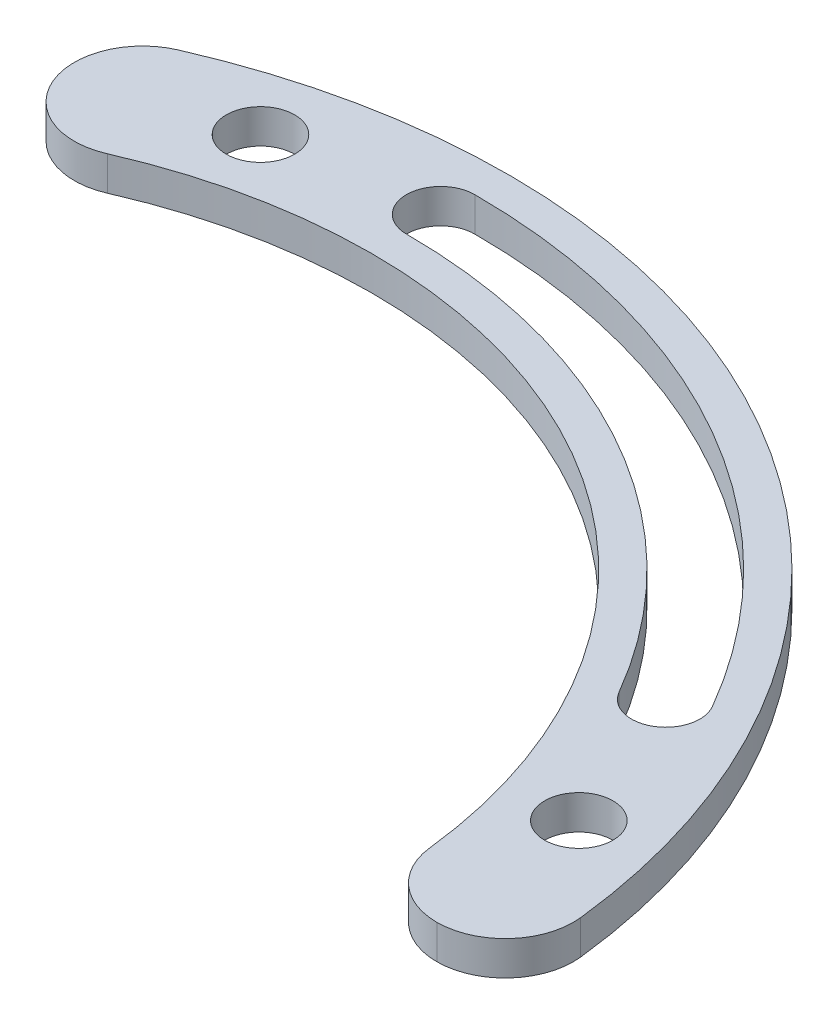
ISO-10303-21;
HEADER;
FILE_DESCRIPTION(('STEP AP214'),'2;1');
FILE_NAME('part.step','',(''),(''),'','','');
FILE_SCHEMA(('AUTOMOTIVE_DESIGN { 1 0 10303 214 1 1 1 1 }'));
ENDSEC;
DATA;
#1=APPLICATION_CONTEXT('core data for automotive mechanical design processes');
#2=APPLICATION_PROTOCOL_DEFINITION('international standard','automotive_design',2000,#1);
#3=PRODUCT_CONTEXT('',#1,'mechanical');
#4=PRODUCT('Part','Part','',(#3));
#5=PRODUCT_RELATED_PRODUCT_CATEGORY('part','',(#4));
#6=PRODUCT_DEFINITION_FORMATION('','',#4);
#7=PRODUCT_DEFINITION_CONTEXT('part definition',#1,'design');
#8=PRODUCT_DEFINITION('design','',#6,#7);
#9=PRODUCT_DEFINITION_SHAPE('','',#8);
#10=(LENGTH_UNIT() NAMED_UNIT(*) SI_UNIT(.MILLI.,.METRE.));
#11=(NAMED_UNIT(*) PLANE_ANGLE_UNIT() SI_UNIT($,.RADIAN.));
#12=(NAMED_UNIT(*) SI_UNIT($,.STERADIAN.) SOLID_ANGLE_UNIT());
#13=UNCERTAINTY_MEASURE_WITH_UNIT(LENGTH_MEASURE(1.E-05),#10,'distance_accuracy_value','');
#14=(GEOMETRIC_REPRESENTATION_CONTEXT(3) GLOBAL_UNCERTAINTY_ASSIGNED_CONTEXT((#13)) GLOBAL_UNIT_ASSIGNED_CONTEXT((#10,
#11,#12)) REPRESENTATION_CONTEXT('',''));
#15=CARTESIAN_POINT('',(0.,0.,0.));
#16=DIRECTION('',(0.,0.,1.));
#17=DIRECTION('',(1.,0.,0.));
#18=AXIS2_PLACEMENT_3D('',#15,#16,#17);
#19=CARTESIAN_POINT('',(0.,1.,0.));
#20=DIRECTION('',(0.,1.,0.));
#21=DIRECTION('',(0.,0.,1.));
#22=AXIS2_PLACEMENT_3D('',#19,#20,#21);
#23=PLANE('',#22);
#24=CARTESIAN_POINT('',(-4.65874281184533,1.,-17.3866648732032));
#25=DIRECTION('',(0.,1.,0.));
#26=DIRECTION('',(0.,0.,1.));
#27=AXIS2_PLACEMENT_3D('',#24,#25,#26);
#28=CIRCLE('',#27,1.);
#29=CARTESIAN_POINT('',(-4.65874281184533,1.,-16.3866648732032));
#30=VERTEX_POINT('',#29);
#31=EDGE_CURVE('E187',#30,#30,#28,.T.);
#32=ORIENTED_EDGE('',*,*,#31,.F.);
#33=EDGE_LOOP('',(#32));
#34=FACE_BOUND('',#33,.T.);
#35=CARTESIAN_POINT('',(-7.21222110243037,1.,-16.4919333848296));
#36=DIRECTION('',(0.,1.,0.));
#37=DIRECTION('',(0.,0.,1.));
#38=AXIS2_PLACEMENT_3D('',#35,#36,#37);
#39=CIRCLE('',#38,2.);
#40=CARTESIAN_POINT('',(-8.01357900270041,1.,-18.3243704275885));
#41=VERTEX_POINT('',#40);
#42=CARTESIAN_POINT('',(-8.94427190999924,1.,-15.4919333848296));
#43=VERTEX_POINT('',#42);
#44=EDGE_CURVE('E70',#41,#43,#39,.T.);
#45=ORIENTED_EDGE('',*,*,#44,.T.);
#46=CARTESIAN_POINT('',(-7.21222110243037,1.,-16.4919333848296));
#47=DIRECTION('',(0.,1.,0.));
#48=DIRECTION('',(0.,0.,1.));
#49=AXIS2_PLACEMENT_3D('',#46,#47,#48);
#50=CIRCLE('',#49,2.);
#51=CARTESIAN_POINT('',(-6.41086320216033,1.,-14.6594963420708));
#52=VERTEX_POINT('',#51);
#53=EDGE_CURVE('E235',#43,#52,#50,.T.);
#54=ORIENTED_EDGE('',*,*,#53,.T.);
#55=CARTESIAN_POINT('',(0.,1.,0.));
#56=DIRECTION('',(0.,-1.,0.));
#57=DIRECTION('',(0.,0.,1.));
#58=AXIS2_PLACEMENT_3D('',#55,#56,#57);
#59=CIRCLE('',#58,16.);
#60=CARTESIAN_POINT('',(15.9009278399985,1.,-1.77777777777779));
#61=VERTEX_POINT('',#60);
#62=EDGE_CURVE('E198',#52,#61,#59,.T.);
#63=ORIENTED_EDGE('',*,*,#62,.T.);
#64=CARTESIAN_POINT('',(17.8885438199983,1.,-2.00000000000001));
#65=DIRECTION('',(0.,1.,0.));
#66=DIRECTION('',(0.,0.,1.));
#67=AXIS2_PLACEMENT_3D('',#64,#65,#66);
#68=CIRCLE('',#67,2.);
#69=CARTESIAN_POINT('',(17.8885438199983,1.,0.));
#70=VERTEX_POINT('',#69);
#71=EDGE_CURVE('E63',#61,#70,#68,.T.);
#72=ORIENTED_EDGE('',*,*,#71,.T.);
#73=CARTESIAN_POINT('',(17.8885438199983,1.,-2.00000000000001));
#74=DIRECTION('',(0.,1.,0.));
#75=DIRECTION('',(0.,0.,1.));
#76=AXIS2_PLACEMENT_3D('',#73,#74,#75);
#77=CIRCLE('',#76,2.);
#78=CARTESIAN_POINT('',(19.8761597999981,1.,-2.22222222222223));
#79=VERTEX_POINT('',#78);
#80=EDGE_CURVE('E228',#70,#79,#77,.T.);
#81=ORIENTED_EDGE('',*,*,#80,.T.);
#82=CARTESIAN_POINT('',(0.,1.,0.));
#83=DIRECTION('',(0.,1.,0.));
#84=DIRECTION('',(0.,0.,1.));
#85=AXIS2_PLACEMENT_3D('',#82,#83,#84);
#86=CIRCLE('',#85,20.);
#87=EDGE_CURVE('E195',#79,#41,#86,.T.);
#88=ORIENTED_EDGE('',*,*,#87,.T.);
#89=EDGE_LOOP('',(#45,#54,#63,#72,#81,#88));
#90=FACE_BOUND('',#89,.T.);
#91=CARTESIAN_POINT('',(17.3866648732032,1.,-4.65874281184539));
#92=DIRECTION('',(0.,1.,0.));
#93=DIRECTION('',(0.,0.,1.));
#94=AXIS2_PLACEMENT_3D('',#91,#92,#93);
#95=CIRCLE('',#94,1.);
#96=CARTESIAN_POINT('',(17.3866648732032,1.,-3.65874281184539));
#97=VERTEX_POINT('',#96);
#98=EDGE_CURVE('E179',#97,#97,#95,.T.);
#99=ORIENTED_EDGE('',*,*,#98,.F.);
#100=EDGE_LOOP('',(#99));
#101=FACE_BOUND('',#100,.T.);
#102=CARTESIAN_POINT('',(0.,1.,0.));
#103=DIRECTION('',(0.,1.,0.));
#104=DIRECTION('',(0.,0.,1.));
#105=AXIS2_PLACEMENT_3D('',#102,#103,#104);
#106=CIRCLE('',#105,19.);
#107=CARTESIAN_POINT('',(16.4544826719043,1.,-9.50000000000003));
#108=VERTEX_POINT('',#107);
#109=CARTESIAN_POINT('',(0.,1.,-19.));
#110=VERTEX_POINT('',#109);
#111=EDGE_CURVE('E136',#108,#110,#106,.T.);
#112=ORIENTED_EDGE('',*,*,#111,.F.);
#113=CARTESIAN_POINT('',(15.5884572681199,1.,-9.00000000000002));
#114=DIRECTION('',(0.,1.,0.));
#115=DIRECTION('',(0.,0.,1.));
#116=AXIS2_PLACEMENT_3D('',#113,#114,#115);
#117=CIRCLE('',#116,0.999999999999999);
#118=CARTESIAN_POINT('',(14.7224318643354,1.,-8.50000000000002));
#119=VERTEX_POINT('',#118);
#120=EDGE_CURVE('E125',#119,#108,#117,.T.);
#121=ORIENTED_EDGE('',*,*,#120,.F.);
#122=CARTESIAN_POINT('',(0.,1.,0.));
#123=DIRECTION('',(0.,-1.,0.));
#124=DIRECTION('',(0.,0.,1.));
#125=AXIS2_PLACEMENT_3D('',#122,#123,#124);
#126=CIRCLE('',#125,17.);
#127=CARTESIAN_POINT('',(0.,1.,-17.));
#128=VERTEX_POINT('',#127);
#129=EDGE_CURVE('E154',#128,#119,#126,.T.);
#130=ORIENTED_EDGE('',*,*,#129,.F.);
#131=CARTESIAN_POINT('',(0.,1.,-18.));
#132=DIRECTION('',(0.,1.,0.));
#133=DIRECTION('',(0.,0.,1.));
#134=AXIS2_PLACEMENT_3D('',#131,#132,#133);
#135=CIRCLE('',#134,0.999999999999997);
#136=EDGE_CURVE('E150',#110,#128,#135,.T.);
#137=ORIENTED_EDGE('',*,*,#136,.F.);
#138=EDGE_LOOP('',(#112,#121,#130,#137));
#139=FACE_BOUND('',#138,.T.);
#140=ADVANCED_FACE('F45',(#34,#90,#101,#139),#23,.T.);
#141=CARTESIAN_POINT('',(0.,0.,0.));
#142=DIRECTION('',(0.,1.,0.));
#143=DIRECTION('',(0.,0.,1.));
#144=AXIS2_PLACEMENT_3D('',#141,#142,#143);
#145=PLANE('',#144);
#146=CARTESIAN_POINT('',(17.3866648732032,0.,-4.65874281184539));
#147=DIRECTION('',(0.,1.,0.));
#148=DIRECTION('',(0.,0.,1.));
#149=AXIS2_PLACEMENT_3D('',#146,#147,#148);
#150=CIRCLE('',#149,1.);
#151=CARTESIAN_POINT('',(17.3866648732032,0.,-3.65874281184539));
#152=VERTEX_POINT('',#151);
#153=EDGE_CURVE('E145',#152,#152,#150,.T.);
#154=ORIENTED_EDGE('',*,*,#153,.T.);
#155=EDGE_LOOP('',(#154));
#156=FACE_BOUND('',#155,.T.);
#157=CARTESIAN_POINT('',(-4.65874281184533,0.,-17.3866648732032));
#158=DIRECTION('',(0.,1.,0.));
#159=DIRECTION('',(0.,0.,1.));
#160=AXIS2_PLACEMENT_3D('',#157,#158,#159);
#161=CIRCLE('',#160,1.);
#162=CARTESIAN_POINT('',(-4.65874281184533,0.,-16.3866648732032));
#163=VERTEX_POINT('',#162);
#164=EDGE_CURVE('E183',#163,#163,#161,.T.);
#165=ORIENTED_EDGE('',*,*,#164,.T.);
#166=EDGE_LOOP('',(#165));
#167=FACE_BOUND('',#166,.T.);
#168=CARTESIAN_POINT('',(0.,0.,0.));
#169=DIRECTION('',(0.,-1.,0.));
#170=DIRECTION('',(0.,0.,1.));
#171=AXIS2_PLACEMENT_3D('',#168,#169,#170);
#172=CIRCLE('',#171,16.);
#173=CARTESIAN_POINT('',(-6.41086320216033,0.,-14.6594963420708));
#174=VERTEX_POINT('',#173);
#175=CARTESIAN_POINT('',(15.9009278399985,0.,-1.77777777777779));
#176=VERTEX_POINT('',#175);
#177=EDGE_CURVE('E199',#174,#176,#172,.T.);
#178=ORIENTED_EDGE('',*,*,#177,.F.);
#179=CARTESIAN_POINT('',(-7.21222110243037,0.,-16.4919333848296));
#180=DIRECTION('',(0.,1.,0.));
#181=DIRECTION('',(0.,0.,1.));
#182=AXIS2_PLACEMENT_3D('',#179,#180,#181);
#183=CIRCLE('',#182,2.);
#184=CARTESIAN_POINT('',(-8.94427190999924,0.,-15.4919333848296));
#185=VERTEX_POINT('',#184);
#186=EDGE_CURVE('E225',#174,#185,#183,.F.);
#187=ORIENTED_EDGE('',*,*,#186,.T.);
#188=CARTESIAN_POINT('',(-7.21222110243037,0.,-16.4919333848296));
#189=DIRECTION('',(0.,1.,0.));
#190=DIRECTION('',(0.,0.,1.));
#191=AXIS2_PLACEMENT_3D('',#188,#189,#190);
#192=CIRCLE('',#191,2.);
#193=CARTESIAN_POINT('',(-8.01357900270041,0.,-18.3243704275885));
#194=VERTEX_POINT('',#193);
#195=EDGE_CURVE('E222',#185,#194,#192,.F.);
#196=ORIENTED_EDGE('',*,*,#195,.T.);
#197=CARTESIAN_POINT('',(0.,0.,0.));
#198=DIRECTION('',(0.,1.,0.));
#199=DIRECTION('',(0.,0.,1.));
#200=AXIS2_PLACEMENT_3D('',#197,#198,#199);
#201=CIRCLE('',#200,20.);
#202=CARTESIAN_POINT('',(19.8761597999981,0.,-2.22222222222223));
#203=VERTEX_POINT('',#202);
#204=EDGE_CURVE('E191',#203,#194,#201,.T.);
#205=ORIENTED_EDGE('',*,*,#204,.F.);
#206=CARTESIAN_POINT('',(17.8885438199983,0.,-2.00000000000001));
#207=DIRECTION('',(0.,1.,0.));
#208=DIRECTION('',(0.,0.,1.));
#209=AXIS2_PLACEMENT_3D('',#206,#207,#208);
#210=CIRCLE('',#209,2.);
#211=CARTESIAN_POINT('',(17.8885438199983,0.,0.));
#212=VERTEX_POINT('',#211);
#213=EDGE_CURVE('E216',#203,#212,#210,.F.);
#214=ORIENTED_EDGE('',*,*,#213,.T.);
#215=CARTESIAN_POINT('',(17.8885438199983,0.,-2.00000000000001));
#216=DIRECTION('',(0.,1.,0.));
#217=DIRECTION('',(0.,0.,1.));
#218=AXIS2_PLACEMENT_3D('',#215,#216,#217);
#219=CIRCLE('',#218,2.);
#220=EDGE_CURVE('E219',#212,#176,#219,.F.);
#221=ORIENTED_EDGE('',*,*,#220,.T.);
#222=EDGE_LOOP('',(#178,#187,#196,#205,#214,#221));
#223=FACE_BOUND('',#222,.T.);
#224=CARTESIAN_POINT('',(15.5884572681199,0.,-9.00000000000002));
#225=DIRECTION('',(0.,1.,0.));
#226=DIRECTION('',(0.,0.,1.));
#227=AXIS2_PLACEMENT_3D('',#224,#225,#226);
#228=CIRCLE('',#227,0.999999999999999);
#229=CARTESIAN_POINT('',(14.7224318643354,0.,-8.50000000000002));
#230=VERTEX_POINT('',#229);
#231=CARTESIAN_POINT('',(16.4544826719043,0.,-9.50000000000003));
#232=VERTEX_POINT('',#231);
#233=EDGE_CURVE('E159',#230,#232,#228,.T.);
#234=ORIENTED_EDGE('',*,*,#233,.T.);
#235=CARTESIAN_POINT('',(0.,0.,0.));
#236=DIRECTION('',(0.,1.,0.));
#237=DIRECTION('',(0.,0.,1.));
#238=AXIS2_PLACEMENT_3D('',#235,#236,#237);
#239=CIRCLE('',#238,19.);
#240=CARTESIAN_POINT('',(0.,0.,-19.));
#241=VERTEX_POINT('',#240);
#242=EDGE_CURVE('E143',#232,#241,#239,.T.);
#243=ORIENTED_EDGE('',*,*,#242,.T.);
#244=CARTESIAN_POINT('',(0.,0.,-18.));
#245=DIRECTION('',(0.,1.,0.));
#246=DIRECTION('',(0.,0.,1.));
#247=AXIS2_PLACEMENT_3D('',#244,#245,#246);
#248=CIRCLE('',#247,0.999999999999997);
#249=CARTESIAN_POINT('',(0.,0.,-17.));
#250=VERTEX_POINT('',#249);
#251=EDGE_CURVE('E165',#241,#250,#248,.T.);
#252=ORIENTED_EDGE('',*,*,#251,.T.);
#253=CARTESIAN_POINT('',(0.,0.,0.));
#254=DIRECTION('',(0.,-1.,0.));
#255=DIRECTION('',(0.,0.,1.));
#256=AXIS2_PLACEMENT_3D('',#253,#254,#255);
#257=CIRCLE('',#256,17.);
#258=EDGE_CURVE('E137',#250,#230,#257,.T.);
#259=ORIENTED_EDGE('',*,*,#258,.T.);
#260=EDGE_LOOP('',(#234,#243,#252,#259));
#261=FACE_BOUND('',#260,.T.);
#262=ADVANCED_FACE('F269',(#156,#167,#223,#261),#145,.F.);
#263=CARTESIAN_POINT('',(0.,1.,0.));
#264=DIRECTION('',(0.,-1.,0.));
#265=DIRECTION('',(0.,0.,-1.));
#266=AXIS2_PLACEMENT_3D('',#263,#264,#265);
#267=CYLINDRICAL_SURFACE('',#266,20.);
#268=ORIENTED_EDGE('',*,*,#204,.T.);
#269=DIRECTION('',(0.,-1.,0.));
#270=VECTOR('',#269,1.);
#271=CARTESIAN_POINT('',(-8.01357900270041,1.,-18.3243704275885));
#272=LINE('',#271,#270);
#273=EDGE_CURVE('E11',#194,#41,#272,.F.);
#274=ORIENTED_EDGE('',*,*,#273,.T.);
#275=ORIENTED_EDGE('',*,*,#87,.F.);
#276=DIRECTION('',(0.,-1.,0.));
#277=VECTOR('',#276,1.);
#278=CARTESIAN_POINT('',(19.8761597999981,1.,-2.22222222222223));
#279=LINE('',#278,#277);
#280=EDGE_CURVE('E55',#79,#203,#279,.T.);
#281=ORIENTED_EDGE('',*,*,#280,.T.);
#282=EDGE_LOOP('',(#268,#274,#275,#281));
#283=FACE_BOUND('',#282,.T.);
#284=ADVANCED_FACE('F256',(#283),#267,.T.);
#285=CARTESIAN_POINT('',(0.,1.,0.));
#286=DIRECTION('',(0.,-1.,0.));
#287=DIRECTION('',(0.,0.,-1.));
#288=AXIS2_PLACEMENT_3D('',#285,#286,#287);
#289=CYLINDRICAL_SURFACE('',#288,16.);
#290=ORIENTED_EDGE('',*,*,#62,.F.);
#291=DIRECTION('',(0.,-1.,0.));
#292=VECTOR('',#291,1.);
#293=CARTESIAN_POINT('',(-6.41086320216033,1.,-14.6594963420708));
#294=LINE('',#293,#292);
#295=EDGE_CURVE('E212',#52,#174,#294,.T.);
#296=ORIENTED_EDGE('',*,*,#295,.T.);
#297=ORIENTED_EDGE('',*,*,#177,.T.);
#298=DIRECTION('',(0.,-1.,0.));
#299=VECTOR('',#298,1.);
#300=CARTESIAN_POINT('',(15.9009278399985,1.,-1.77777777777779));
#301=LINE('',#300,#299);
#302=EDGE_CURVE('E202',#176,#61,#301,.F.);
#303=ORIENTED_EDGE('',*,*,#302,.T.);
#304=EDGE_LOOP('',(#290,#296,#297,#303));
#305=FACE_BOUND('',#304,.T.);
#306=ADVANCED_FACE('F266',(#305),#289,.F.);
#307=CARTESIAN_POINT('',(-4.65874281184533,1.,-17.3866648732032));
#308=DIRECTION('',(0.,-1.,0.));
#309=DIRECTION('',(0.,0.,-1.));
#310=AXIS2_PLACEMENT_3D('',#307,#308,#309);
#311=CYLINDRICAL_SURFACE('',#310,1.);
#312=ORIENTED_EDGE('',*,*,#31,.T.);
#313=EDGE_LOOP('',(#312));
#314=FACE_BOUND('',#313,.T.);
#315=ORIENTED_EDGE('',*,*,#164,.F.);
#316=EDGE_LOOP('',(#315));
#317=FACE_BOUND('',#316,.T.);
#318=ADVANCED_FACE('F295',(#314,#317),#311,.F.);
#319=CARTESIAN_POINT('',(17.3866648732032,1.,-4.65874281184539));
#320=DIRECTION('',(0.,-1.,0.));
#321=DIRECTION('',(0.,0.,-1.));
#322=AXIS2_PLACEMENT_3D('',#319,#320,#321);
#323=CYLINDRICAL_SURFACE('',#322,1.);
#324=ORIENTED_EDGE('',*,*,#98,.T.);
#325=EDGE_LOOP('',(#324));
#326=FACE_BOUND('',#325,.T.);
#327=ORIENTED_EDGE('',*,*,#153,.F.);
#328=EDGE_LOOP('',(#327));
#329=FACE_BOUND('',#328,.T.);
#330=ADVANCED_FACE('F352',(#326,#329),#323,.F.);
#331=CARTESIAN_POINT('',(15.5884572681199,1.,-9.00000000000002));
#332=DIRECTION('',(0.,-1.,0.));
#333=DIRECTION('',(0.,0.,-1.));
#334=AXIS2_PLACEMENT_3D('',#331,#332,#333);
#335=CYLINDRICAL_SURFACE('',#334,0.999999999999999);
#336=ORIENTED_EDGE('',*,*,#233,.F.);
#337=DIRECTION('',(0.,-1.,0.));
#338=VECTOR('',#337,1.);
#339=CARTESIAN_POINT('',(14.7224318643354,1.,-8.50000000000002));
#340=LINE('',#339,#338);
#341=EDGE_CURVE('E131',#119,#230,#340,.T.);
#342=ORIENTED_EDGE('',*,*,#341,.F.);
#343=ORIENTED_EDGE('',*,*,#120,.T.);
#344=DIRECTION('',(0.,-1.,0.));
#345=VECTOR('',#344,1.);
#346=CARTESIAN_POINT('',(16.4544826719043,1.,-9.50000000000003));
#347=LINE('',#346,#345);
#348=EDGE_CURVE('E128',#108,#232,#347,.T.);
#349=ORIENTED_EDGE('',*,*,#348,.T.);
#350=EDGE_LOOP('',(#336,#342,#343,#349));
#351=FACE_BOUND('',#350,.T.);
#352=ADVANCED_FACE('F127',(#351),#335,.F.);
#353=CARTESIAN_POINT('',(0.,1.,0.));
#354=DIRECTION('',(0.,-1.,0.));
#355=DIRECTION('',(0.,0.,-1.));
#356=AXIS2_PLACEMENT_3D('',#353,#354,#355);
#357=CYLINDRICAL_SURFACE('',#356,19.);
#358=ORIENTED_EDGE('',*,*,#242,.F.);
#359=ORIENTED_EDGE('',*,*,#348,.F.);
#360=ORIENTED_EDGE('',*,*,#111,.T.);
#361=DIRECTION('',(0.,-1.,0.));
#362=VECTOR('',#361,1.);
#363=CARTESIAN_POINT('',(0.,1.,-19.));
#364=LINE('',#363,#362);
#365=EDGE_CURVE('E146',#110,#241,#364,.T.);
#366=ORIENTED_EDGE('',*,*,#365,.T.);
#367=EDGE_LOOP('',(#358,#359,#360,#366));
#368=FACE_BOUND('',#367,.T.);
#369=ADVANCED_FACE('F140',(#368),#357,.F.);
#370=CARTESIAN_POINT('',(0.,1.,-18.));
#371=DIRECTION('',(0.,-1.,0.));
#372=DIRECTION('',(0.,0.,-1.));
#373=AXIS2_PLACEMENT_3D('',#370,#371,#372);
#374=CYLINDRICAL_SURFACE('',#373,0.999999999999997);
#375=ORIENTED_EDGE('',*,*,#251,.F.);
#376=ORIENTED_EDGE('',*,*,#365,.F.);
#377=ORIENTED_EDGE('',*,*,#136,.T.);
#378=DIRECTION('',(0.,-1.,0.));
#379=VECTOR('',#378,1.);
#380=CARTESIAN_POINT('',(0.,1.,-17.));
#381=LINE('',#380,#379);
#382=EDGE_CURVE('E174',#128,#250,#381,.T.);
#383=ORIENTED_EDGE('',*,*,#382,.T.);
#384=EDGE_LOOP('',(#375,#376,#377,#383));
#385=FACE_BOUND('',#384,.T.);
#386=ADVANCED_FACE('F279',(#385),#374,.F.);
#387=CARTESIAN_POINT('',(0.,1.,0.));
#388=DIRECTION('',(0.,-1.,0.));
#389=DIRECTION('',(0.,0.,-1.));
#390=AXIS2_PLACEMENT_3D('',#387,#388,#389);
#391=CYLINDRICAL_SURFACE('',#390,17.);
#392=ORIENTED_EDGE('',*,*,#258,.F.);
#393=ORIENTED_EDGE('',*,*,#382,.F.);
#394=ORIENTED_EDGE('',*,*,#129,.T.);
#395=ORIENTED_EDGE('',*,*,#341,.T.);
#396=EDGE_LOOP('',(#392,#393,#394,#395));
#397=FACE_BOUND('',#396,.T.);
#398=ADVANCED_FACE('F276',(#397),#391,.T.);
#399=CARTESIAN_POINT('',(-7.21222110243037,1.,-16.4919333848296));
#400=DIRECTION('',(0.,-1.,0.));
#401=DIRECTION('',(0.,0.,-1.));
#402=AXIS2_PLACEMENT_3D('',#399,#400,#401);
#403=CYLINDRICAL_SURFACE('',#402,2.);
#404=DIRECTION('',(0.,-1.,0.));
#405=VECTOR('',#404,1.);
#406=CARTESIAN_POINT('',(-8.94427190999924,1.,-15.4919333848296));
#407=LINE('',#406,#405);
#408=EDGE_CURVE('E162',#43,#185,#407,.T.);
#409=ORIENTED_EDGE('',*,*,#408,.F.);
#410=ORIENTED_EDGE('',*,*,#44,.F.);
#411=ORIENTED_EDGE('',*,*,#273,.F.);
#412=ORIENTED_EDGE('',*,*,#195,.F.);
#413=EDGE_LOOP('',(#409,#410,#411,#412));
#414=FACE_BOUND('',#413,.T.);
#415=ADVANCED_FACE('F261',(#414),#403,.T.);
#416=CARTESIAN_POINT('',(-7.21222110243037,1.,-16.4919333848296));
#417=DIRECTION('',(0.,-1.,0.));
#418=DIRECTION('',(0.,0.,-1.));
#419=AXIS2_PLACEMENT_3D('',#416,#417,#418);
#420=CYLINDRICAL_SURFACE('',#419,2.);
#421=ORIENTED_EDGE('',*,*,#53,.F.);
#422=ORIENTED_EDGE('',*,*,#408,.T.);
#423=ORIENTED_EDGE('',*,*,#186,.F.);
#424=ORIENTED_EDGE('',*,*,#295,.F.);
#425=EDGE_LOOP('',(#421,#422,#423,#424));
#426=FACE_BOUND('',#425,.T.);
#427=ADVANCED_FACE('F263',(#426),#420,.T.);
#428=CARTESIAN_POINT('',(17.8885438199983,1.,-2.00000000000001));
#429=DIRECTION('',(0.,-1.,0.));
#430=DIRECTION('',(0.,0.,-1.));
#431=AXIS2_PLACEMENT_3D('',#428,#429,#430);
#432=CYLINDRICAL_SURFACE('',#431,2.);
#433=ORIENTED_EDGE('',*,*,#280,.F.);
#434=ORIENTED_EDGE('',*,*,#80,.F.);
#435=DIRECTION('',(0.,-1.,0.));
#436=VECTOR('',#435,1.);
#437=CARTESIAN_POINT('',(17.8885438199983,1.,0.));
#438=LINE('',#437,#436);
#439=EDGE_CURVE('E49',#212,#70,#438,.F.);
#440=ORIENTED_EDGE('',*,*,#439,.F.);
#441=ORIENTED_EDGE('',*,*,#213,.F.);
#442=EDGE_LOOP('',(#433,#434,#440,#441));
#443=FACE_BOUND('',#442,.T.);
#444=ADVANCED_FACE('F47',(#443),#432,.T.);
#445=CARTESIAN_POINT('',(17.8885438199983,1.,-2.00000000000001));
#446=DIRECTION('',(0.,-1.,0.));
#447=DIRECTION('',(0.,0.,-1.));
#448=AXIS2_PLACEMENT_3D('',#445,#446,#447);
#449=CYLINDRICAL_SURFACE('',#448,2.);
#450=ORIENTED_EDGE('',*,*,#71,.F.);
#451=ORIENTED_EDGE('',*,*,#302,.F.);
#452=ORIENTED_EDGE('',*,*,#220,.F.);
#453=ORIENTED_EDGE('',*,*,#439,.T.);
#454=EDGE_LOOP('',(#450,#451,#452,#453));
#455=FACE_BOUND('',#454,.T.);
#456=ADVANCED_FACE('F248',(#455),#449,.T.);
#457=CLOSED_SHELL('',(#140,#262,#284,#306,#318,#330,#352,#369,#386,#398,#415,#427,#444,#456));
#458=MANIFOLD_SOLID_BREP('B2',#457);
#459=ADVANCED_BREP_SHAPE_REPRESENTATION('',(#18,#458),#14);
#460=SHAPE_DEFINITION_REPRESENTATION(#9,#459);
ENDSEC;
END-ISO-10303-21;
